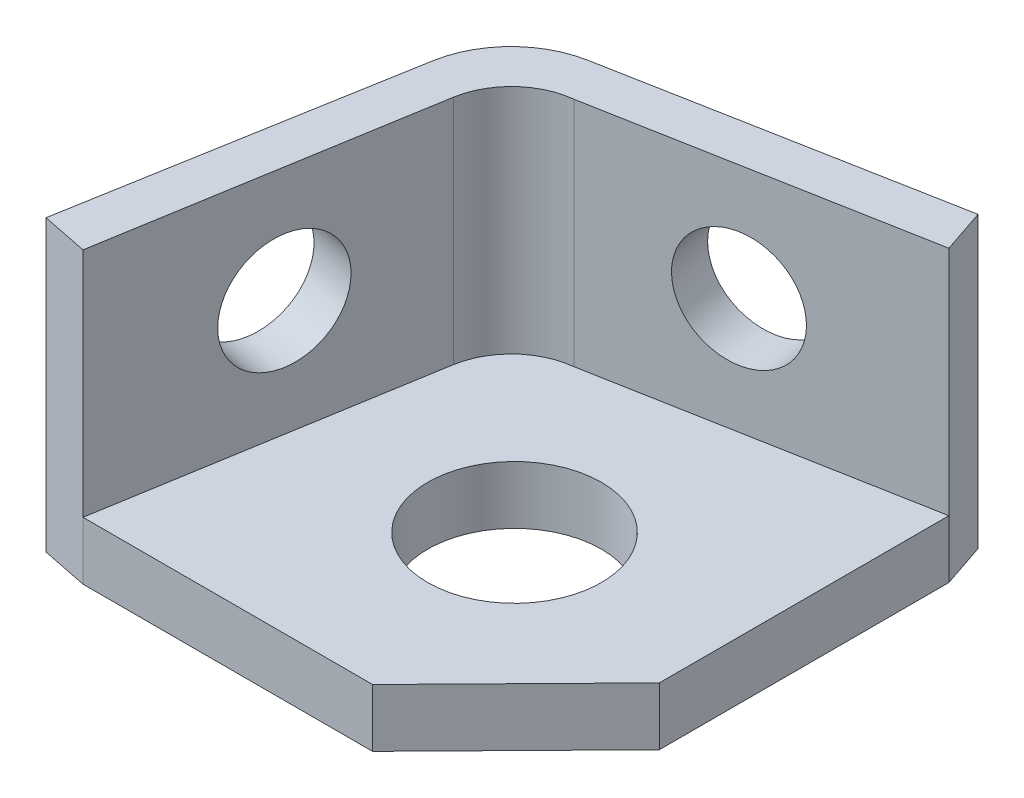
ISO-10303-21;
HEADER;
FILE_DESCRIPTION(('STEP AP214'),'2;1');
FILE_NAME('part.step','',(''),(''),'','','');
FILE_SCHEMA(('AUTOMOTIVE_DESIGN { 1 0 10303 214 1 1 1 1 }'));
ENDSEC;
DATA;
#1=APPLICATION_CONTEXT('core data for automotive mechanical design processes');
#2=APPLICATION_PROTOCOL_DEFINITION('international standard','automotive_design',2000,#1);
#3=PRODUCT_CONTEXT('',#1,'mechanical');
#4=PRODUCT('Part','Part','',(#3));
#5=PRODUCT_RELATED_PRODUCT_CATEGORY('part','',(#4));
#6=PRODUCT_DEFINITION_FORMATION('','',#4);
#7=PRODUCT_DEFINITION_CONTEXT('part definition',#1,'design');
#8=PRODUCT_DEFINITION('design','',#6,#7);
#9=PRODUCT_DEFINITION_SHAPE('','',#8);
#10=(LENGTH_UNIT() NAMED_UNIT(*) SI_UNIT(.MILLI.,.METRE.));
#11=(NAMED_UNIT(*) PLANE_ANGLE_UNIT() SI_UNIT($,.RADIAN.));
#12=(NAMED_UNIT(*) SI_UNIT($,.STERADIAN.) SOLID_ANGLE_UNIT());
#13=UNCERTAINTY_MEASURE_WITH_UNIT(LENGTH_MEASURE(1.E-05),#10,'distance_accuracy_value','');
#14=(GEOMETRIC_REPRESENTATION_CONTEXT(3) GLOBAL_UNCERTAINTY_ASSIGNED_CONTEXT((#13)) GLOBAL_UNIT_ASSIGNED_CONTEXT((#10,
#11,#12)) REPRESENTATION_CONTEXT('',''));
#15=CARTESIAN_POINT('',(0.,0.,0.));
#16=DIRECTION('',(0.,0.,1.));
#17=DIRECTION('',(1.,0.,0.));
#18=AXIS2_PLACEMENT_3D('',#15,#16,#17);
#19=CARTESIAN_POINT('',(0.,10.,22.3721590909091));
#20=DIRECTION('',(0.,0.,-1.));
#21=DIRECTION('',(-1.,0.,0.));
#22=AXIS2_PLACEMENT_3D('',#19,#20,#21);
#23=PLANE('',#22);
#24=DIRECTION('',(1.,0.,0.));
#25=VECTOR('',#24,1.);
#26=CARTESIAN_POINT('',(0.,0.,22.3721590909091));
#27=LINE('',#26,#25);
#28=CARTESIAN_POINT('',(-37.7286474618227,0.,22.3721590909091));
#29=VERTEX_POINT('',#28);
#30=CARTESIAN_POINT('',(12.2713525381773,0.,22.3721590909091));
#31=VERTEX_POINT('',#30);
#32=EDGE_CURVE('E69',#29,#31,#27,.T.);
#33=ORIENTED_EDGE('',*,*,#32,.T.);
#34=DIRECTION('',(0.,-1.,0.));
#35=VECTOR('',#34,1.);
#36=CARTESIAN_POINT('',(12.2713525381773,10.,22.3721590909091));
#37=LINE('',#36,#35);
#38=CARTESIAN_POINT('',(12.2713525381773,10.,22.3721590909091));
#39=VERTEX_POINT('',#38);
#40=EDGE_CURVE('E51',#39,#31,#37,.T.);
#41=ORIENTED_EDGE('',*,*,#40,.F.);
#42=DIRECTION('',(1.,0.,0.));
#43=VECTOR('',#42,1.);
#44=CARTESIAN_POINT('',(0.,10.,22.3721590909091));
#45=LINE('',#44,#43);
#46=CARTESIAN_POINT('',(-37.7286474618227,10.,22.3721590909091));
#47=VERTEX_POINT('',#46);
#48=EDGE_CURVE('E207',#47,#39,#45,.T.);
#49=ORIENTED_EDGE('',*,*,#48,.F.);
#50=DIRECTION('',(0.,-1.,0.));
#51=VECTOR('',#50,1.);
#52=CARTESIAN_POINT('',(-37.7286474618227,10.,22.3721590909091));
#53=LINE('',#52,#51);
#54=EDGE_CURVE('E11',#47,#29,#53,.T.);
#55=ORIENTED_EDGE('',*,*,#54,.T.);
#56=EDGE_LOOP('',(#33,#41,#49,#55));
#57=FACE_BOUND('',#56,.T.);
#58=ADVANCED_FACE('F41',(#57),#23,.F.);
#59=CARTESIAN_POINT('',(17.4394660868899,10.,17.1020946427365));
#60=DIRECTION('',(-0.713979120658137,0.,-0.70016699098446));
#61=DIRECTION('',(-0.70016699098446,0.,0.713979120658137));
#62=AXIS2_PLACEMENT_3D('',#59,#60,#61);
#63=PLANE('',#62);
#64=DIRECTION('',(0.70016699098446,0.,-0.713979120658137));
#65=VECTOR('',#64,1.);
#66=CARTESIAN_POINT('',(17.4394660868899,0.,17.1020946427365));
#67=LINE('',#66,#65);
#68=CARTESIAN_POINT('',(36.7877204096584,0.,-2.62784090909089));
#69=VERTEX_POINT('',#68);
#70=EDGE_CURVE('E216',#31,#69,#67,.T.);
#71=ORIENTED_EDGE('',*,*,#70,.T.);
#72=DIRECTION('',(0.,-1.,0.));
#73=VECTOR('',#72,1.);
#74=CARTESIAN_POINT('',(36.7877204096584,10.,-2.62784090909089));
#75=LINE('',#74,#73);
#76=CARTESIAN_POINT('',(36.7877204096584,10.,-2.62784090909089));
#77=VERTEX_POINT('',#76);
#78=EDGE_CURVE('E221',#77,#69,#75,.T.);
#79=ORIENTED_EDGE('',*,*,#78,.F.);
#80=DIRECTION('',(0.70016699098446,0.,-0.713979120658137));
#81=VECTOR('',#80,1.);
#82=CARTESIAN_POINT('',(17.4394660868899,10.,17.1020946427365));
#83=LINE('',#82,#81);
#84=EDGE_CURVE('E59',#39,#77,#83,.T.);
#85=ORIENTED_EDGE('',*,*,#84,.F.);
#86=ORIENTED_EDGE('',*,*,#40,.T.);
#87=EDGE_LOOP('',(#71,#79,#85,#86));
#88=FACE_BOUND('',#87,.T.);
#89=ADVANCED_FACE('F226',(#88),#63,.F.);
#90=CARTESIAN_POINT('',(1.78772040965842,10.,-12.6278409090909));
#91=DIRECTION('',(0.,-1.,0.));
#92=DIRECTION('',(0.,0.,-1.));
#93=AXIS2_PLACEMENT_3D('',#90,#91,#92);
#94=CYLINDRICAL_SURFACE('',#93,15.);
#95=CARTESIAN_POINT('',(1.78772040965842,10.,-12.6278409090909));
#96=DIRECTION('',(0.,1.,0.));
#97=DIRECTION('',(0.,0.,1.));
#98=AXIS2_PLACEMENT_3D('',#95,#96,#97);
#99=CIRCLE('',#98,15.);
#100=CARTESIAN_POINT('',(1.78772040965842,10.,2.3721590909091));
#101=VERTEX_POINT('',#100);
#102=EDGE_CURVE('E198',#101,#101,#99,.T.);
#103=ORIENTED_EDGE('',*,*,#102,.T.);
#104=EDGE_LOOP('',(#103));
#105=FACE_BOUND('',#104,.T.);
#106=CARTESIAN_POINT('',(1.78772040965842,0.,-12.6278409090909));
#107=DIRECTION('',(0.,1.,0.));
#108=DIRECTION('',(0.,0.,1.));
#109=AXIS2_PLACEMENT_3D('',#106,#107,#108);
#110=CIRCLE('',#109,15.);
#111=CARTESIAN_POINT('',(1.78772040965842,0.,2.3721590909091));
#112=VERTEX_POINT('',#111);
#113=EDGE_CURVE('E147',#112,#112,#110,.T.);
#114=ORIENTED_EDGE('',*,*,#113,.F.);
#115=EDGE_LOOP('',(#114));
#116=FACE_BOUND('',#115,.T.);
#117=ADVANCED_FACE('F43',(#105,#116),#94,.F.);
#118=CARTESIAN_POINT('',(36.7877204096584,10.,0.));
#119=DIRECTION('',(-1.,0.,0.));
#120=DIRECTION('',(0.,0.,1.));
#121=AXIS2_PLACEMENT_3D('',#118,#119,#120);
#122=PLANE('',#121);
#123=DIRECTION('',(0.,0.,-1.));
#124=VECTOR('',#123,1.);
#125=CARTESIAN_POINT('',(36.7877204096584,0.,0.));
#126=LINE('',#125,#124);
#127=CARTESIAN_POINT('',(36.7877204096584,0.,-52.6278409090909));
#128=VERTEX_POINT('',#127);
#129=EDGE_CURVE('E202',#69,#128,#126,.T.);
#130=ORIENTED_EDGE('',*,*,#129,.T.);
#131=DIRECTION('',(0.,-1.,0.));
#132=VECTOR('',#131,1.);
#133=CARTESIAN_POINT('',(36.7877204096584,10.,-52.6278409090909));
#134=LINE('',#133,#132);
#135=CARTESIAN_POINT('',(36.7877204096584,10.,-52.6278409090909));
#136=VERTEX_POINT('',#135);
#137=EDGE_CURVE('E212',#136,#128,#134,.T.);
#138=ORIENTED_EDGE('',*,*,#137,.F.);
#139=DIRECTION('',(0.,0.,-1.));
#140=VECTOR('',#139,1.);
#141=CARTESIAN_POINT('',(36.7877204096584,10.,0.));
#142=LINE('',#141,#140);
#143=EDGE_CURVE('E210',#77,#136,#142,.T.);
#144=ORIENTED_EDGE('',*,*,#143,.F.);
#145=ORIENTED_EDGE('',*,*,#78,.T.);
#146=EDGE_LOOP('',(#130,#138,#144,#145));
#147=FACE_BOUND('',#146,.T.);
#148=ADVANCED_FACE('F235',(#147),#122,.F.);
#149=CARTESIAN_POINT('',(0.,10.,0.));
#150=DIRECTION('',(0.,1.,0.));
#151=DIRECTION('',(0.,0.,1.));
#152=AXIS2_PLACEMENT_3D('',#149,#150,#151);
#153=PLANE('',#152);
#154=ORIENTED_EDGE('',*,*,#102,.F.);
#155=EDGE_LOOP('',(#154));
#156=FACE_BOUND('',#155,.T.);
#157=DIRECTION('',(-0.983369917109263,0.,0.181613892983224));
#158=VECTOR('',#157,1.);
#159=CARTESIAN_POINT('',(-8.18560593460436,10.,-44.3219320789767));
#160=LINE('',#159,#158);
#161=CARTESIAN_POINT('',(-17.8494318411621,10.,-42.5371662309819));
#162=VERTEX_POINT('',#161);
#163=EDGE_CURVE('E201',#136,#162,#160,.T.);
#164=ORIENTED_EDGE('',*,*,#163,.T.);
#165=CARTESIAN_POINT('',(-16.5609333312721,10.,-30.4234038593318));
#166=DIRECTION('',(0.,1.,0.));
#167=DIRECTION('',(0.,0.,1.));
#168=AXIS2_PLACEMENT_3D('',#165,#166,#167);
#169=CIRCLE('',#168,12.1820961745831);
#170=CARTESIAN_POINT('',(-28.5766269295375,10.,-32.4300365011966));
#171=VERTEX_POINT('',#170);
#172=EDGE_CURVE('E78',#171,#162,#169,.F.);
#173=ORIENTED_EDGE('',*,*,#172,.F.);
#174=DIRECTION('',(0.164719816122562,0.,-0.986340398734914));
#175=VECTOR('',#174,1.);
#176=CARTESIAN_POINT('',(-33.0701700722802,10.,-5.52275090874775));
#177=LINE('',#176,#175);
#178=EDGE_CURVE('E205',#47,#171,#177,.T.);
#179=ORIENTED_EDGE('',*,*,#178,.F.);
#180=ORIENTED_EDGE('',*,*,#48,.T.);
#181=ORIENTED_EDGE('',*,*,#84,.T.);
#182=ORIENTED_EDGE('',*,*,#143,.T.);
#183=EDGE_LOOP('',(#164,#173,#179,#180,#181,#182));
#184=FACE_BOUND('',#183,.T.);
#185=ADVANCED_FACE('F237',(#156,#184),#153,.T.);
#186=CARTESIAN_POINT('',(0.,0.,0.));
#187=DIRECTION('',(0.,1.,0.));
#188=DIRECTION('',(0.,0.,1.));
#189=AXIS2_PLACEMENT_3D('',#186,#187,#188);
#190=PLANE('',#189);
#191=ORIENTED_EDGE('',*,*,#113,.T.);
#192=EDGE_LOOP('',(#191));
#193=FACE_BOUND('',#192,.T.);
#194=DIRECTION('',(-0.319155660926457,0.,-0.947702307741517));
#195=VECTOR('',#194,1.);
#196=CARTESIAN_POINT('',(48.9585674059508,0.,-16.4876710870271));
#197=LINE('',#196,#195);
#198=CARTESIAN_POINT('',(34.2344751222468,0.,-60.209459371023));
#199=VERTEX_POINT('',#198);
#200=EDGE_CURVE('E171',#128,#199,#197,.T.);
#201=ORIENTED_EDGE('',*,*,#200,.F.);
#202=ORIENTED_EDGE('',*,*,#129,.F.);
#203=ORIENTED_EDGE('',*,*,#70,.F.);
#204=ORIENTED_EDGE('',*,*,#32,.F.);
#205=DIRECTION('',(-0.98031210419252,0.,-0.197454243746832));
#206=VECTOR('',#205,1.);
#207=CARTESIAN_POINT('',(-5.80147814955862,0.,28.8029223596365));
#208=LINE('',#207,#206);
#209=CARTESIAN_POINT('',(-45.7286474618227,0.,20.7608008885376));
#210=VERTEX_POINT('',#209);
#211=EDGE_CURVE('E141',#29,#210,#208,.T.);
#212=ORIENTED_EDGE('',*,*,#211,.T.);
#213=DIRECTION('',(0.172065388603836,0.,-0.985085530319379));
#214=VECTOR('',#213,1.);
#215=CARTESIAN_POINT('',(-40.8558447780045,0.,-7.13631110405832));
#216=LINE('',#215,#214);
#217=CARTESIAN_POINT('',(-35.799091445582,0.,-36.0865525127634));
#218=VERTEX_POINT('',#217);
#219=EDGE_CURVE('E179',#210,#218,#216,.T.);
#220=ORIENTED_EDGE('',*,*,#219,.T.);
#221=CARTESIAN_POINT('',(-19.418073466664,0.,-33.2252718041176));
#222=DIRECTION('',(0.,1.,0.));
#223=DIRECTION('',(0.,0.,1.));
#224=AXIS2_PLACEMENT_3D('',#221,#222,#223);
#225=CIRCLE('',#224,16.6290311599714);
#226=CARTESIAN_POINT('',(-22.4841502305368,0.,-49.5691957698407));
#227=VERTEX_POINT('',#226);
#228=EDGE_CURVE('E176',#218,#227,#225,.F.);
#229=ORIENTED_EDGE('',*,*,#228,.T.);
#230=DIRECTION('',(-0.98285485236599,0.,0.184380962088356));
#231=VECTOR('',#230,1.);
#232=CARTESIAN_POINT('',(-9.74729473767396,0.,-51.9585960603324));
#233=LINE('',#232,#231);
#234=EDGE_CURVE('E173',#199,#227,#233,.T.);
#235=ORIENTED_EDGE('',*,*,#234,.F.);
#236=EDGE_LOOP('',(#201,#202,#203,#204,#212,#220,#229,#235));
#237=FACE_BOUND('',#236,.T.);
#238=ADVANCED_FACE('F231',(#193,#237),#190,.F.);
#239=CARTESIAN_POINT('',(-16.5609333312721,50.,-30.4234038593318));
#240=DIRECTION('',(0.,-1.,0.));
#241=DIRECTION('',(0.,0.,-1.));
#242=AXIS2_PLACEMENT_3D('',#239,#240,#241);
#243=CYLINDRICAL_SURFACE('',#242,12.1820961745831);
#244=ORIENTED_EDGE('',*,*,#172,.T.);
#245=DIRECTION('',(0.,-1.,0.));
#246=VECTOR('',#245,1.);
#247=CARTESIAN_POINT('',(-17.8494318411621,50.,-42.5371662309819));
#248=LINE('',#247,#246);
#249=CARTESIAN_POINT('',(-17.8494318411621,50.,-42.5371662309819));
#250=VERTEX_POINT('',#249);
#251=EDGE_CURVE('E143',#250,#162,#248,.T.);
#252=ORIENTED_EDGE('',*,*,#251,.F.);
#253=CARTESIAN_POINT('',(-16.5609333312721,50.,-30.4234038593318));
#254=DIRECTION('',(0.,1.,0.));
#255=DIRECTION('',(0.,0.,1.));
#256=AXIS2_PLACEMENT_3D('',#253,#254,#255);
#257=CIRCLE('',#256,12.1820961745831);
#258=CARTESIAN_POINT('',(-28.5766269295375,50.,-32.4300365011966));
#259=VERTEX_POINT('',#258);
#260=EDGE_CURVE('E133',#259,#250,#257,.F.);
#261=ORIENTED_EDGE('',*,*,#260,.F.);
#262=DIRECTION('',(0.,-1.,0.));
#263=VECTOR('',#262,1.);
#264=CARTESIAN_POINT('',(-28.5766269295375,50.,-32.4300365011966));
#265=LINE('',#264,#263);
#266=EDGE_CURVE('E170',#259,#171,#265,.T.);
#267=ORIENTED_EDGE('',*,*,#266,.T.);
#268=EDGE_LOOP('',(#244,#252,#261,#267));
#269=FACE_BOUND('',#268,.T.);
#270=ADVANCED_FACE('F144',(#269),#243,.F.);
#271=CARTESIAN_POINT('',(-8.18560593460436,50.,-44.3219320789767));
#272=DIRECTION('',(0.181613892983224,0.,0.983369917109263));
#273=DIRECTION('',(0.983369917109263,0.,-0.181613892983224));
#274=AXIS2_PLACEMENT_3D('',#271,#272,#273);
#275=PLANE('',#274);
#276=CARTESIAN_POINT('',(6.19342369083017,30.,-46.9775263799218));
#277=DIRECTION('',(0.181613892983224,0.,0.983369917109263));
#278=DIRECTION('',(-0.983369917109263,0.,0.181613892983224));
#279=AXIS2_PLACEMENT_3D('',#276,#277,#278);
#280=ELLIPSE('',#279,10.0000396099725,10.);
#281=CARTESIAN_POINT('',(-3.64031443151784,30.,-45.1613802563683));
#282=VERTEX_POINT('',#281);
#283=EDGE_CURVE('E306',#282,#282,#280,.T.);
#284=ORIENTED_EDGE('',*,*,#283,.F.);
#285=EDGE_LOOP('',(#284));
#286=FACE_BOUND('',#285,.T.);
#287=ORIENTED_EDGE('',*,*,#251,.T.);
#288=ORIENTED_EDGE('',*,*,#163,.F.);
#289=DIRECTION('',(0.,-1.,0.));
#290=VECTOR('',#289,1.);
#291=CARTESIAN_POINT('',(36.7877204096584,50.,-52.6278409090909));
#292=LINE('',#291,#290);
#293=CARTESIAN_POINT('',(36.7877204096584,50.,-52.6278409090909));
#294=VERTEX_POINT('',#293);
#295=EDGE_CURVE('E148',#294,#136,#292,.T.);
#296=ORIENTED_EDGE('',*,*,#295,.F.);
#297=DIRECTION('',(-0.983369917109263,0.,0.181613892983224));
#298=VECTOR('',#297,1.);
#299=CARTESIAN_POINT('',(-8.18560593460436,50.,-44.3219320789767));
#300=LINE('',#299,#298);
#301=EDGE_CURVE('E136',#294,#250,#300,.T.);
#302=ORIENTED_EDGE('',*,*,#301,.T.);
#303=EDGE_LOOP('',(#287,#288,#296,#302));
#304=FACE_BOUND('',#303,.T.);
#305=ADVANCED_FACE('F150',(#286,#304),#275,.T.);
#306=CARTESIAN_POINT('',(48.9585674059508,50.,-16.4876710870271));
#307=DIRECTION('',(-0.947702307741517,0.,0.319155660926457));
#308=DIRECTION('',(0.319155660926457,0.,0.947702307741517));
#309=AXIS2_PLACEMENT_3D('',#306,#307,#308);
#310=PLANE('',#309);
#311=ORIENTED_EDGE('',*,*,#200,.T.);
#312=DIRECTION('',(0.,-1.,0.));
#313=VECTOR('',#312,1.);
#314=CARTESIAN_POINT('',(34.2344751222468,50.,-60.209459371023));
#315=LINE('',#314,#313);
#316=CARTESIAN_POINT('',(34.2344751222468,50.,-60.209459371023));
#317=VERTEX_POINT('',#316);
#318=EDGE_CURVE('E194',#317,#199,#315,.T.);
#319=ORIENTED_EDGE('',*,*,#318,.F.);
#320=DIRECTION('',(-0.319155660926457,0.,-0.947702307741517));
#321=VECTOR('',#320,1.);
#322=CARTESIAN_POINT('',(48.9585674059508,50.,-16.4876710870271));
#323=LINE('',#322,#321);
#324=EDGE_CURVE('E153',#294,#317,#323,.T.);
#325=ORIENTED_EDGE('',*,*,#324,.F.);
#326=ORIENTED_EDGE('',*,*,#295,.T.);
#327=ORIENTED_EDGE('',*,*,#137,.T.);
#328=EDGE_LOOP('',(#311,#319,#325,#326,#327));
#329=FACE_BOUND('',#328,.T.);
#330=ADVANCED_FACE('F240',(#329),#310,.F.);
#331=CARTESIAN_POINT('',(-9.74729473767396,50.,-51.9585960603324));
#332=DIRECTION('',(0.184380962088356,0.,0.98285485236599));
#333=DIRECTION('',(0.98285485236599,0.,-0.184380962088356));
#334=AXIS2_PLACEMENT_3D('',#331,#332,#333);
#335=PLANE('',#334);
#336=CARTESIAN_POINT('',(4.74882955126707,30.,-54.6780305083724));
#337=DIRECTION('',(-0.184380962088356,0.,-0.98285485236599));
#338=DIRECTION('',(-0.98285485236599,0.,0.184380962088356));
#339=AXIS2_PLACEMENT_3D('',#336,#337,#338);
#340=CIRCLE('',#339,10.);
#341=CARTESIAN_POINT('',(-5.07971897239284,30.,-52.8342208874888));
#342=VERTEX_POINT('',#341);
#343=EDGE_CURVE('E309',#342,#342,#340,.T.);
#344=ORIENTED_EDGE('',*,*,#343,.F.);
#345=EDGE_LOOP('',(#344));
#346=FACE_BOUND('',#345,.T.);
#347=ORIENTED_EDGE('',*,*,#234,.T.);
#348=DIRECTION('',(0.,-1.,0.));
#349=VECTOR('',#348,1.);
#350=CARTESIAN_POINT('',(-22.4841502305368,50.,-49.5691957698407));
#351=LINE('',#350,#349);
#352=CARTESIAN_POINT('',(-22.4841502305368,50.,-49.5691957698407));
#353=VERTEX_POINT('',#352);
#354=EDGE_CURVE('E192',#353,#227,#351,.T.);
#355=ORIENTED_EDGE('',*,*,#354,.F.);
#356=DIRECTION('',(-0.98285485236599,0.,0.184380962088356));
#357=VECTOR('',#356,1.);
#358=CARTESIAN_POINT('',(-9.74729473767396,50.,-51.9585960603324));
#359=LINE('',#358,#357);
#360=EDGE_CURVE('E155',#317,#353,#359,.T.);
#361=ORIENTED_EDGE('',*,*,#360,.F.);
#362=ORIENTED_EDGE('',*,*,#318,.T.);
#363=EDGE_LOOP('',(#347,#355,#361,#362));
#364=FACE_BOUND('',#363,.T.);
#365=ADVANCED_FACE('F247',(#346,#364),#335,.F.);
#366=CARTESIAN_POINT('',(-19.418073466664,50.,-33.2252718041176));
#367=DIRECTION('',(0.,-1.,0.));
#368=DIRECTION('',(0.,0.,-1.));
#369=AXIS2_PLACEMENT_3D('',#366,#367,#368);
#370=CYLINDRICAL_SURFACE('',#369,16.6290311599714);
#371=ORIENTED_EDGE('',*,*,#228,.F.);
#372=DIRECTION('',(0.,-1.,0.));
#373=VECTOR('',#372,1.);
#374=CARTESIAN_POINT('',(-35.799091445582,50.,-36.0865525127634));
#375=LINE('',#374,#373);
#376=CARTESIAN_POINT('',(-35.799091445582,50.,-36.0865525127634));
#377=VERTEX_POINT('',#376);
#378=EDGE_CURVE('E190',#377,#218,#375,.T.);
#379=ORIENTED_EDGE('',*,*,#378,.F.);
#380=CARTESIAN_POINT('',(-19.418073466664,50.,-33.2252718041176));
#381=DIRECTION('',(0.,1.,0.));
#382=DIRECTION('',(0.,0.,1.));
#383=AXIS2_PLACEMENT_3D('',#380,#381,#382);
#384=CIRCLE('',#383,16.6290311599714);
#385=EDGE_CURVE('E160',#377,#353,#384,.F.);
#386=ORIENTED_EDGE('',*,*,#385,.T.);
#387=ORIENTED_EDGE('',*,*,#354,.T.);
#388=EDGE_LOOP('',(#371,#379,#386,#387));
#389=FACE_BOUND('',#388,.T.);
#390=ADVANCED_FACE('F250',(#389),#370,.T.);
#391=CARTESIAN_POINT('',(-40.8558447780045,50.,-7.13631110405832));
#392=DIRECTION('',(-0.985085530319378,0.,-0.172065388603836));
#393=DIRECTION('',(-0.172065388603836,0.,0.985085530319378));
#394=AXIS2_PLACEMENT_3D('',#391,#392,#393);
#395=PLANE('',#394);
#396=CARTESIAN_POINT('',(-40.5666858037076,30.,-8.7917650210437));
#397=DIRECTION('',(-0.985085530319379,0.,-0.172065388603836));
#398=DIRECTION('',(-0.172065388603836,0.,0.985085530319378));
#399=AXIS2_PLACEMENT_3D('',#396,#397,#398);
#400=CIRCLE('',#399,10.);
#401=CARTESIAN_POINT('',(-42.287339689746,30.,1.05909028215008));
#402=VERTEX_POINT('',#401);
#403=EDGE_CURVE('E311',#402,#402,#400,.T.);
#404=ORIENTED_EDGE('',*,*,#403,.F.);
#405=EDGE_LOOP('',(#404));
#406=FACE_BOUND('',#405,.T.);
#407=ORIENTED_EDGE('',*,*,#219,.F.);
#408=DIRECTION('',(0.,-1.,0.));
#409=VECTOR('',#408,1.);
#410=CARTESIAN_POINT('',(-45.7286474618227,50.,20.7608008885376));
#411=LINE('',#410,#409);
#412=CARTESIAN_POINT('',(-45.7286474618227,50.,20.7608008885376));
#413=VERTEX_POINT('',#412);
#414=EDGE_CURVE('E188',#413,#210,#411,.T.);
#415=ORIENTED_EDGE('',*,*,#414,.F.);
#416=DIRECTION('',(0.172065388603836,0.,-0.985085530319379));
#417=VECTOR('',#416,1.);
#418=CARTESIAN_POINT('',(-40.8558447780045,50.,-7.13631110405832));
#419=LINE('',#418,#417);
#420=EDGE_CURVE('E163',#413,#377,#419,.T.);
#421=ORIENTED_EDGE('',*,*,#420,.T.);
#422=ORIENTED_EDGE('',*,*,#378,.T.);
#423=EDGE_LOOP('',(#407,#415,#421,#422));
#424=FACE_BOUND('',#423,.T.);
#425=ADVANCED_FACE('F253',(#406,#424),#395,.T.);
#426=CARTESIAN_POINT('',(-5.80147814955862,50.,28.8029223596365));
#427=DIRECTION('',(-0.197454243746832,0.,0.98031210419252));
#428=DIRECTION('',(0.98031210419252,0.,0.197454243746832));
#429=AXIS2_PLACEMENT_3D('',#426,#427,#428);
#430=PLANE('',#429);
#431=ORIENTED_EDGE('',*,*,#211,.F.);
#432=ORIENTED_EDGE('',*,*,#54,.F.);
#433=DIRECTION('',(0.,-1.,0.));
#434=VECTOR('',#433,1.);
#435=CARTESIAN_POINT('',(-37.7286474618227,50.,22.3721590909091));
#436=LINE('',#435,#434);
#437=CARTESIAN_POINT('',(-37.7286474618227,50.,22.3721590909091));
#438=VERTEX_POINT('',#437);
#439=EDGE_CURVE('E185',#438,#47,#436,.T.);
#440=ORIENTED_EDGE('',*,*,#439,.F.);
#441=DIRECTION('',(-0.98031210419252,0.,-0.197454243746832));
#442=VECTOR('',#441,1.);
#443=CARTESIAN_POINT('',(-5.80147814955862,50.,28.8029223596365));
#444=LINE('',#443,#442);
#445=EDGE_CURVE('E166',#438,#413,#444,.T.);
#446=ORIENTED_EDGE('',*,*,#445,.T.);
#447=ORIENTED_EDGE('',*,*,#414,.T.);
#448=EDGE_LOOP('',(#431,#432,#440,#446,#447));
#449=FACE_BOUND('',#448,.T.);
#450=ADVANCED_FACE('F255',(#449),#430,.T.);
#451=CARTESIAN_POINT('',(-33.0701700722802,50.,-5.52275090874775));
#452=DIRECTION('',(-0.986340398734914,0.,-0.164719816122562));
#453=DIRECTION('',(-0.164719816122562,0.,0.986340398734914));
#454=AXIS2_PLACEMENT_3D('',#451,#452,#453);
#455=PLANE('',#454);
#456=CARTESIAN_POINT('',(-32.7521914458379,30.,-7.42680333290136));
#457=DIRECTION('',(-0.986340398734914,0.,-0.164719816122562));
#458=DIRECTION('',(0.164719816122562,0.,-0.986340398734914));
#459=AXIS2_PLACEMENT_3D('',#456,#457,#458);
#460=ELLIPSE('',#459,10.0002776683589,10.);
#461=CARTESIAN_POINT('',(-31.1049475471313,30.,-17.2904811957703));
#462=VERTEX_POINT('',#461);
#463=EDGE_CURVE('E45',#462,#462,#460,.T.);
#464=ORIENTED_EDGE('',*,*,#463,.T.);
#465=EDGE_LOOP('',(#464));
#466=FACE_BOUND('',#465,.T.);
#467=ORIENTED_EDGE('',*,*,#178,.T.);
#468=ORIENTED_EDGE('',*,*,#266,.F.);
#469=DIRECTION('',(0.164719816122562,0.,-0.986340398734914));
#470=VECTOR('',#469,1.);
#471=CARTESIAN_POINT('',(-33.0701700722802,50.,-5.52275090874775));
#472=LINE('',#471,#470);
#473=EDGE_CURVE('E139',#438,#259,#472,.T.);
#474=ORIENTED_EDGE('',*,*,#473,.F.);
#475=ORIENTED_EDGE('',*,*,#439,.T.);
#476=EDGE_LOOP('',(#467,#468,#474,#475));
#477=FACE_BOUND('',#476,.T.);
#478=ADVANCED_FACE('F257',(#466,#477),#455,.F.);
#479=CARTESIAN_POINT('',(0.,50.,0.));
#480=DIRECTION('',(0.,1.,0.));
#481=DIRECTION('',(0.,0.,1.));
#482=AXIS2_PLACEMENT_3D('',#479,#480,#481);
#483=PLANE('',#482);
#484=ORIENTED_EDGE('',*,*,#260,.T.);
#485=ORIENTED_EDGE('',*,*,#301,.F.);
#486=ORIENTED_EDGE('',*,*,#324,.T.);
#487=ORIENTED_EDGE('',*,*,#360,.T.);
#488=ORIENTED_EDGE('',*,*,#385,.F.);
#489=ORIENTED_EDGE('',*,*,#420,.F.);
#490=ORIENTED_EDGE('',*,*,#445,.F.);
#491=ORIENTED_EDGE('',*,*,#473,.T.);
#492=EDGE_LOOP('',(#484,#485,#486,#487,#488,#489,#490,#491));
#493=FACE_BOUND('',#492,.T.);
#494=ADVANCED_FACE('F134',(#493),#483,.T.);
#495=CARTESIAN_POINT('',(39.779785195791,30.,5.24239377021719));
#496=DIRECTION('',(-0.985085530319378,0.,-0.172065388603836));
#497=DIRECTION('',(-0.172065388603836,0.,0.985085530319378));
#498=AXIS2_PLACEMENT_3D('',#495,#496,#497);
#499=CYLINDRICAL_SURFACE('',#498,10.);
#500=ORIENTED_EDGE('',*,*,#403,.T.);
#501=EDGE_LOOP('',(#500));
#502=FACE_BOUND('',#501,.T.);
#503=ORIENTED_EDGE('',*,*,#463,.F.);
#504=EDGE_LOOP('',(#503));
#505=FACE_BOUND('',#504,.T.);
#506=ADVANCED_FACE('F294',(#502,#505),#499,.F.);
#507=CARTESIAN_POINT('',(19.8010485891316,30.,25.5588136466742));
#508=DIRECTION('',(-0.184380962088356,0.,-0.98285485236599));
#509=DIRECTION('',(-0.98285485236599,0.,0.184380962088356));
#510=AXIS2_PLACEMENT_3D('',#507,#508,#509);
#511=CYLINDRICAL_SURFACE('',#510,10.);
#512=ORIENTED_EDGE('',*,*,#283,.T.);
#513=EDGE_LOOP('',(#512));
#514=FACE_BOUND('',#513,.T.);
#515=ORIENTED_EDGE('',*,*,#343,.T.);
#516=EDGE_LOOP('',(#515));
#517=FACE_BOUND('',#516,.T.);
#518=ADVANCED_FACE('F297',(#514,#517),#511,.F.);
#519=CLOSED_SHELL('',(#58,#89,#117,#148,#185,#238,#270,#305,#330,#365,#390,#425,#450,#478,#494,
#506,#518));
#520=MANIFOLD_SOLID_BREP('B2',#519);
#521=ADVANCED_BREP_SHAPE_REPRESENTATION('',(#18,#520),#14);
#522=SHAPE_DEFINITION_REPRESENTATION(#9,#521);
ENDSEC;
END-ISO-10303-21;
